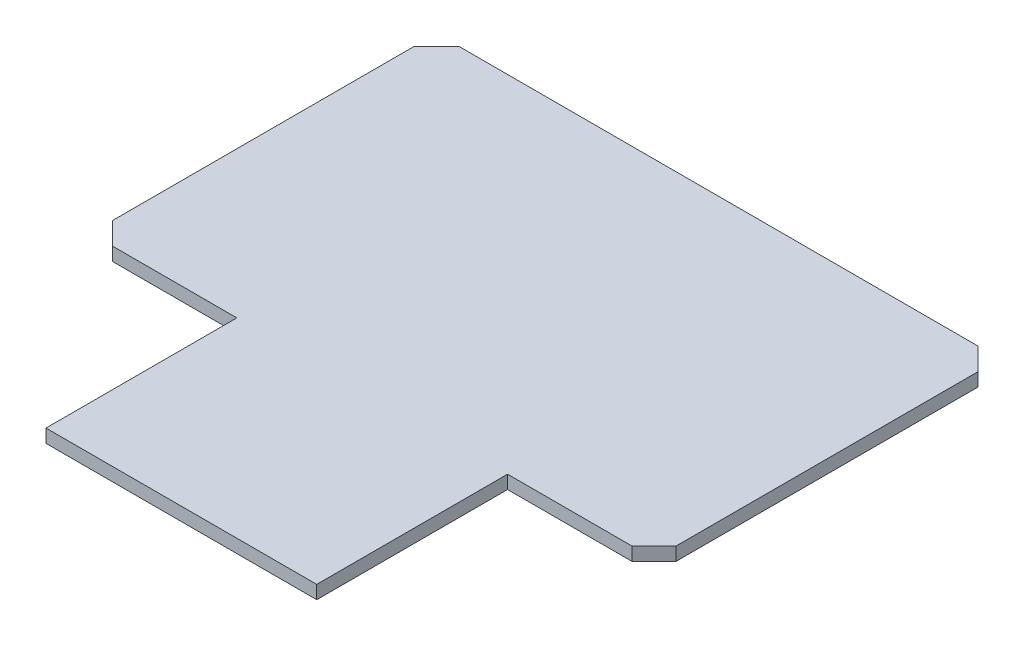
ISO-10303-21;
HEADER;
FILE_DESCRIPTION(('STEP AP214'),'2;1');
FILE_NAME('part.step','',(''),(''),'','','');
FILE_SCHEMA(('AUTOMOTIVE_DESIGN { 1 0 10303 214 1 1 1 1 }'));
ENDSEC;
DATA;
#1=APPLICATION_CONTEXT('core data for automotive mechanical design processes');
#2=APPLICATION_PROTOCOL_DEFINITION('international standard','automotive_design',2000,#1);
#3=PRODUCT_CONTEXT('',#1,'mechanical');
#4=PRODUCT('Part','Part','',(#3));
#5=PRODUCT_RELATED_PRODUCT_CATEGORY('part','',(#4));
#6=PRODUCT_DEFINITION_FORMATION('','',#4);
#7=PRODUCT_DEFINITION_CONTEXT('part definition',#1,'design');
#8=PRODUCT_DEFINITION('design','',#6,#7);
#9=PRODUCT_DEFINITION_SHAPE('','',#8);
#10=(LENGTH_UNIT() NAMED_UNIT(*) SI_UNIT(.MILLI.,.METRE.));
#11=(NAMED_UNIT(*) PLANE_ANGLE_UNIT() SI_UNIT($,.RADIAN.));
#12=(NAMED_UNIT(*) SI_UNIT($,.STERADIAN.) SOLID_ANGLE_UNIT());
#13=UNCERTAINTY_MEASURE_WITH_UNIT(LENGTH_MEASURE(1.E-05),#10,'distance_accuracy_value','');
#14=(GEOMETRIC_REPRESENTATION_CONTEXT(3) GLOBAL_UNCERTAINTY_ASSIGNED_CONTEXT((#13)) GLOBAL_UNIT_ASSIGNED_CONTEXT((#10,
#11,#12)) REPRESENTATION_CONTEXT('',''));
#15=CARTESIAN_POINT('',(0.,0.,0.));
#16=DIRECTION('',(0.,0.,1.));
#17=DIRECTION('',(1.,0.,0.));
#18=AXIS2_PLACEMENT_3D('',#15,#16,#17);
#19=CARTESIAN_POINT('',(30.5,3.,-43.));
#20=DIRECTION('',(-1.,0.,0.));
#21=DIRECTION('',(0.,0.,1.));
#22=AXIS2_PLACEMENT_3D('',#19,#20,#21);
#23=PLANE('',#22);
#24=DIRECTION('',(0.,0.,-1.));
#25=VECTOR('',#24,1.);
#26=CARTESIAN_POINT('',(30.5,0.,-43.));
#27=LINE('',#26,#25);
#28=CARTESIAN_POINT('',(30.5,0.,0.));
#29=VERTEX_POINT('',#28);
#30=CARTESIAN_POINT('',(30.5,0.,-43.));
#31=VERTEX_POINT('',#30);
#32=EDGE_CURVE('E215',#29,#31,#27,.T.);
#33=ORIENTED_EDGE('',*,*,#32,.T.);
#34=DIRECTION('',(0.,-1.,0.));
#35=VECTOR('',#34,1.);
#36=CARTESIAN_POINT('',(30.5,3.,-43.));
#37=LINE('',#36,#35);
#38=CARTESIAN_POINT('',(30.5,3.,-43.));
#39=VERTEX_POINT('',#38);
#40=EDGE_CURVE('E135',#39,#31,#37,.T.);
#41=ORIENTED_EDGE('',*,*,#40,.F.);
#42=DIRECTION('',(0.,0.,-1.));
#43=VECTOR('',#42,1.);
#44=CARTESIAN_POINT('',(30.5,3.,-43.));
#45=LINE('',#44,#43);
#46=CARTESIAN_POINT('',(30.5,3.,0.));
#47=VERTEX_POINT('',#46);
#48=EDGE_CURVE('E130',#47,#39,#45,.T.);
#49=ORIENTED_EDGE('',*,*,#48,.F.);
#50=DIRECTION('',(0.,-1.,0.));
#51=VECTOR('',#50,1.);
#52=CARTESIAN_POINT('',(30.5,3.,0.));
#53=LINE('',#52,#51);
#54=EDGE_CURVE('E133',#47,#29,#53,.T.);
#55=ORIENTED_EDGE('',*,*,#54,.T.);
#56=EDGE_LOOP('',(#33,#41,#49,#55));
#57=FACE_BOUND('',#56,.T.);
#58=ADVANCED_FACE('F39',(#57),#23,.F.);
#59=CARTESIAN_POINT('',(63.5,3.,-43.));
#60=DIRECTION('',(0.,0.,-1.));
#61=DIRECTION('',(-1.,0.,0.));
#62=AXIS2_PLACEMENT_3D('',#59,#60,#61);
#63=PLANE('',#62);
#64=DIRECTION('',(1.,0.,0.));
#65=VECTOR('',#64,1.);
#66=CARTESIAN_POINT('',(63.5,0.,-43.));
#67=LINE('',#66,#65);
#68=CARTESIAN_POINT('',(58.5,0.,-43.));
#69=VERTEX_POINT('',#68);
#70=EDGE_CURVE('E193',#31,#69,#67,.T.);
#71=ORIENTED_EDGE('',*,*,#70,.T.);
#72=DIRECTION('',(0.,1.,0.));
#73=VECTOR('',#72,1.);
#74=CARTESIAN_POINT('',(58.5,3.,-43.));
#75=LINE('',#74,#73);
#76=CARTESIAN_POINT('',(58.5,3.,-43.));
#77=VERTEX_POINT('',#76);
#78=EDGE_CURVE('E187',#69,#77,#75,.T.);
#79=ORIENTED_EDGE('',*,*,#78,.T.);
#80=DIRECTION('',(1.,0.,0.));
#81=VECTOR('',#80,1.);
#82=CARTESIAN_POINT('',(63.5,3.,-43.));
#83=LINE('',#82,#81);
#84=EDGE_CURVE('E138',#39,#77,#83,.T.);
#85=ORIENTED_EDGE('',*,*,#84,.F.);
#86=ORIENTED_EDGE('',*,*,#40,.T.);
#87=EDGE_LOOP('',(#71,#79,#85,#86));
#88=FACE_BOUND('',#87,.T.);
#89=ADVANCED_FACE('F191',(#88),#63,.F.);
#90=CARTESIAN_POINT('',(63.5,3.,-121.));
#91=DIRECTION('',(-1.,0.,0.));
#92=DIRECTION('',(0.,0.,1.));
#93=AXIS2_PLACEMENT_3D('',#90,#91,#92);
#94=PLANE('',#93);
#95=DIRECTION('',(0.,0.,-1.));
#96=VECTOR('',#95,1.);
#97=CARTESIAN_POINT('',(63.5,3.,-121.));
#98=LINE('',#97,#96);
#99=CARTESIAN_POINT('',(63.5,3.,-48.));
#100=VERTEX_POINT('',#99);
#101=CARTESIAN_POINT('',(63.5,3.,-116.));
#102=VERTEX_POINT('',#101);
#103=EDGE_CURVE('E197',#100,#102,#98,.T.);
#104=ORIENTED_EDGE('',*,*,#103,.F.);
#105=DIRECTION('',(0.,-1.,0.));
#106=VECTOR('',#105,1.);
#107=CARTESIAN_POINT('',(63.5,3.,-48.));
#108=LINE('',#107,#106);
#109=CARTESIAN_POINT('',(63.5,0.,-48.));
#110=VERTEX_POINT('',#109);
#111=EDGE_CURVE('E184',#100,#110,#108,.T.);
#112=ORIENTED_EDGE('',*,*,#111,.T.);
#113=DIRECTION('',(0.,0.,-1.));
#114=VECTOR('',#113,1.);
#115=CARTESIAN_POINT('',(63.5,0.,-121.));
#116=LINE('',#115,#114);
#117=CARTESIAN_POINT('',(63.5,0.,-116.));
#118=VERTEX_POINT('',#117);
#119=EDGE_CURVE('E205',#110,#118,#116,.T.);
#120=ORIENTED_EDGE('',*,*,#119,.T.);
#121=DIRECTION('',(0.,1.,0.));
#122=VECTOR('',#121,1.);
#123=CARTESIAN_POINT('',(63.5,3.,-116.));
#124=LINE('',#123,#122);
#125=EDGE_CURVE('E182',#118,#102,#124,.T.);
#126=ORIENTED_EDGE('',*,*,#125,.T.);
#127=EDGE_LOOP('',(#104,#112,#120,#126));
#128=FACE_BOUND('',#127,.T.);
#129=ADVANCED_FACE('F204',(#128),#94,.F.);
#130=CARTESIAN_POINT('',(-63.5,3.,-121.));
#131=DIRECTION('',(0.,0.,1.));
#132=DIRECTION('',(1.,0.,0.));
#133=AXIS2_PLACEMENT_3D('',#130,#131,#132);
#134=PLANE('',#133);
#135=DIRECTION('',(-1.,0.,0.));
#136=VECTOR('',#135,1.);
#137=CARTESIAN_POINT('',(-63.5,3.,-121.));
#138=LINE('',#137,#136);
#139=CARTESIAN_POINT('',(58.5,3.,-121.));
#140=VERTEX_POINT('',#139);
#141=CARTESIAN_POINT('',(-58.5,3.,-121.));
#142=VERTEX_POINT('',#141);
#143=EDGE_CURVE('E240',#140,#142,#138,.T.);
#144=ORIENTED_EDGE('',*,*,#143,.F.);
#145=DIRECTION('',(0.,-1.,0.));
#146=VECTOR('',#145,1.);
#147=CARTESIAN_POINT('',(58.5,3.,-121.));
#148=LINE('',#147,#146);
#149=CARTESIAN_POINT('',(58.5,0.,-121.));
#150=VERTEX_POINT('',#149);
#151=EDGE_CURVE('E11',#140,#150,#148,.T.);
#152=ORIENTED_EDGE('',*,*,#151,.T.);
#153=DIRECTION('',(-1.,0.,0.));
#154=VECTOR('',#153,1.);
#155=CARTESIAN_POINT('',(-63.5,0.,-121.));
#156=LINE('',#155,#154);
#157=CARTESIAN_POINT('',(-58.5,0.,-121.));
#158=VERTEX_POINT('',#157);
#159=EDGE_CURVE('E211',#150,#158,#156,.T.);
#160=ORIENTED_EDGE('',*,*,#159,.T.);
#161=DIRECTION('',(0.,1.,0.));
#162=VECTOR('',#161,1.);
#163=CARTESIAN_POINT('',(-58.5,3.,-121.));
#164=LINE('',#163,#162);
#165=EDGE_CURVE('E48',#158,#142,#164,.T.);
#166=ORIENTED_EDGE('',*,*,#165,.T.);
#167=EDGE_LOOP('',(#144,#152,#160,#166));
#168=FACE_BOUND('',#167,.T.);
#169=ADVANCED_FACE('F245',(#168),#134,.F.);
#170=CARTESIAN_POINT('',(-63.5,3.,-43.));
#171=DIRECTION('',(1.,0.,0.));
#172=DIRECTION('',(0.,0.,-1.));
#173=AXIS2_PLACEMENT_3D('',#170,#171,#172);
#174=PLANE('',#173);
#175=DIRECTION('',(0.,0.,1.));
#176=VECTOR('',#175,1.);
#177=CARTESIAN_POINT('',(-63.5,0.,-43.));
#178=LINE('',#177,#176);
#179=CARTESIAN_POINT('',(-63.5,0.,-116.));
#180=VERTEX_POINT('',#179);
#181=CARTESIAN_POINT('',(-63.5,0.,-48.));
#182=VERTEX_POINT('',#181);
#183=EDGE_CURVE('E213',#180,#182,#178,.T.);
#184=ORIENTED_EDGE('',*,*,#183,.T.);
#185=DIRECTION('',(0.,1.,0.));
#186=VECTOR('',#185,1.);
#187=CARTESIAN_POINT('',(-63.5,3.,-48.));
#188=LINE('',#187,#186);
#189=CARTESIAN_POINT('',(-63.5,3.,-48.));
#190=VERTEX_POINT('',#189);
#191=EDGE_CURVE('E173',#182,#190,#188,.T.);
#192=ORIENTED_EDGE('',*,*,#191,.T.);
#193=DIRECTION('',(0.,0.,1.));
#194=VECTOR('',#193,1.);
#195=CARTESIAN_POINT('',(-63.5,3.,-43.));
#196=LINE('',#195,#194);
#197=CARTESIAN_POINT('',(-63.5,3.,-116.));
#198=VERTEX_POINT('',#197);
#199=EDGE_CURVE('E238',#198,#190,#196,.T.);
#200=ORIENTED_EDGE('',*,*,#199,.F.);
#201=DIRECTION('',(0.,-1.,0.));
#202=VECTOR('',#201,1.);
#203=CARTESIAN_POINT('',(-63.5,3.,-116.));
#204=LINE('',#203,#202);
#205=EDGE_CURVE('E170',#198,#180,#204,.T.);
#206=ORIENTED_EDGE('',*,*,#205,.T.);
#207=EDGE_LOOP('',(#184,#192,#200,#206));
#208=FACE_BOUND('',#207,.T.);
#209=ADVANCED_FACE('F252',(#208),#174,.F.);
#210=CARTESIAN_POINT('',(-30.5,3.,-43.));
#211=DIRECTION('',(0.,0.,-1.));
#212=DIRECTION('',(-1.,0.,0.));
#213=AXIS2_PLACEMENT_3D('',#210,#211,#212);
#214=PLANE('',#213);
#215=DIRECTION('',(1.,0.,0.));
#216=VECTOR('',#215,1.);
#217=CARTESIAN_POINT('',(-30.5,3.,-43.));
#218=LINE('',#217,#216);
#219=CARTESIAN_POINT('',(-58.5,3.,-43.));
#220=VERTEX_POINT('',#219);
#221=CARTESIAN_POINT('',(-30.5,3.,-43.));
#222=VERTEX_POINT('',#221);
#223=EDGE_CURVE('E236',#220,#222,#218,.T.);
#224=ORIENTED_EDGE('',*,*,#223,.F.);
#225=DIRECTION('',(0.,-1.,0.));
#226=VECTOR('',#225,1.);
#227=CARTESIAN_POINT('',(-58.5,3.,-43.));
#228=LINE('',#227,#226);
#229=CARTESIAN_POINT('',(-58.5,0.,-43.));
#230=VERTEX_POINT('',#229);
#231=EDGE_CURVE('E154',#220,#230,#228,.T.);
#232=ORIENTED_EDGE('',*,*,#231,.T.);
#233=DIRECTION('',(1.,0.,0.));
#234=VECTOR('',#233,1.);
#235=CARTESIAN_POINT('',(-30.5,0.,-43.));
#236=LINE('',#235,#234);
#237=CARTESIAN_POINT('',(-30.5,0.,-43.));
#238=VERTEX_POINT('',#237);
#239=EDGE_CURVE('E221',#230,#238,#236,.T.);
#240=ORIENTED_EDGE('',*,*,#239,.T.);
#241=DIRECTION('',(0.,-1.,0.));
#242=VECTOR('',#241,1.);
#243=CARTESIAN_POINT('',(-30.5,3.,-43.));
#244=LINE('',#243,#242);
#245=EDGE_CURVE('E159',#222,#238,#244,.T.);
#246=ORIENTED_EDGE('',*,*,#245,.F.);
#247=EDGE_LOOP('',(#224,#232,#240,#246));
#248=FACE_BOUND('',#247,.T.);
#249=ADVANCED_FACE('F258',(#248),#214,.F.);
#250=CARTESIAN_POINT('',(-30.5,3.,0.));
#251=DIRECTION('',(1.,0.,0.));
#252=DIRECTION('',(0.,0.,-1.));
#253=AXIS2_PLACEMENT_3D('',#250,#251,#252);
#254=PLANE('',#253);
#255=DIRECTION('',(0.,0.,1.));
#256=VECTOR('',#255,1.);
#257=CARTESIAN_POINT('',(-30.5,0.,0.));
#258=LINE('',#257,#256);
#259=CARTESIAN_POINT('',(-30.5,0.,0.));
#260=VERTEX_POINT('',#259);
#261=EDGE_CURVE('E223',#238,#260,#258,.T.);
#262=ORIENTED_EDGE('',*,*,#261,.T.);
#263=DIRECTION('',(0.,-1.,0.));
#264=VECTOR('',#263,1.);
#265=CARTESIAN_POINT('',(-30.5,3.,0.));
#266=LINE('',#265,#264);
#267=CARTESIAN_POINT('',(-30.5,3.,0.));
#268=VERTEX_POINT('',#267);
#269=EDGE_CURVE('E226',#268,#260,#266,.T.);
#270=ORIENTED_EDGE('',*,*,#269,.F.);
#271=DIRECTION('',(0.,0.,1.));
#272=VECTOR('',#271,1.);
#273=CARTESIAN_POINT('',(-30.5,3.,0.));
#274=LINE('',#273,#272);
#275=EDGE_CURVE('E145',#222,#268,#274,.T.);
#276=ORIENTED_EDGE('',*,*,#275,.F.);
#277=ORIENTED_EDGE('',*,*,#245,.T.);
#278=EDGE_LOOP('',(#262,#270,#276,#277));
#279=FACE_BOUND('',#278,.T.);
#280=ADVANCED_FACE('F231',(#279),#254,.F.);
#281=CARTESIAN_POINT('',(0.,3.,0.));
#282=DIRECTION('',(0.,0.,-1.));
#283=DIRECTION('',(-1.,0.,0.));
#284=AXIS2_PLACEMENT_3D('',#281,#282,#283);
#285=PLANE('',#284);
#286=DIRECTION('',(1.,0.,0.));
#287=VECTOR('',#286,1.);
#288=CARTESIAN_POINT('',(0.,0.,0.));
#289=LINE('',#288,#287);
#290=EDGE_CURVE('E149',#260,#29,#289,.T.);
#291=ORIENTED_EDGE('',*,*,#290,.T.);
#292=ORIENTED_EDGE('',*,*,#54,.F.);
#293=DIRECTION('',(1.,0.,0.));
#294=VECTOR('',#293,1.);
#295=CARTESIAN_POINT('',(30.5,3.,0.));
#296=LINE('',#295,#294);
#297=EDGE_CURVE('E139',#268,#47,#296,.T.);
#298=ORIENTED_EDGE('',*,*,#297,.F.);
#299=ORIENTED_EDGE('',*,*,#269,.T.);
#300=EDGE_LOOP('',(#291,#292,#298,#299));
#301=FACE_BOUND('',#300,.T.);
#302=ADVANCED_FACE('F151',(#301),#285,.F.);
#303=CARTESIAN_POINT('',(0.,3.,0.));
#304=DIRECTION('',(0.,-1.,0.));
#305=DIRECTION('',(0.,0.,-1.));
#306=AXIS2_PLACEMENT_3D('',#303,#304,#305);
#307=PLANE('',#306);
#308=ORIENTED_EDGE('',*,*,#199,.T.);
#309=DIRECTION('',(-0.707106781186547,0.,-0.707106781186549));
#310=VECTOR('',#309,1.);
#311=CARTESIAN_POINT('',(-58.5,3.,-43.));
#312=LINE('',#311,#310);
#313=EDGE_CURVE('E180',#190,#220,#312,.F.);
#314=ORIENTED_EDGE('',*,*,#313,.T.);
#315=ORIENTED_EDGE('',*,*,#223,.T.);
#316=ORIENTED_EDGE('',*,*,#275,.T.);
#317=ORIENTED_EDGE('',*,*,#297,.T.);
#318=ORIENTED_EDGE('',*,*,#48,.T.);
#319=ORIENTED_EDGE('',*,*,#84,.T.);
#320=DIRECTION('',(-0.707106781186549,0.,0.707106781186547));
#321=VECTOR('',#320,1.);
#322=CARTESIAN_POINT('',(63.5,3.,-48.));
#323=LINE('',#322,#321);
#324=EDGE_CURVE('E178',#77,#100,#323,.F.);
#325=ORIENTED_EDGE('',*,*,#324,.T.);
#326=ORIENTED_EDGE('',*,*,#103,.T.);
#327=DIRECTION('',(0.707106781186547,0.,0.707106781186549));
#328=VECTOR('',#327,1.);
#329=CARTESIAN_POINT('',(58.5,3.,-121.));
#330=LINE('',#329,#328);
#331=EDGE_CURVE('E61',#102,#140,#330,.F.);
#332=ORIENTED_EDGE('',*,*,#331,.T.);
#333=ORIENTED_EDGE('',*,*,#143,.T.);
#334=DIRECTION('',(0.707106781186549,0.,-0.707106781186547));
#335=VECTOR('',#334,1.);
#336=CARTESIAN_POINT('',(-63.5,3.,-116.));
#337=LINE('',#336,#335);
#338=EDGE_CURVE('E175',#142,#198,#337,.F.);
#339=ORIENTED_EDGE('',*,*,#338,.T.);
#340=EDGE_LOOP('',(#308,#314,#315,#316,#317,#318,#319,#325,#326,#332,#333,#339));
#341=FACE_BOUND('',#340,.T.);
#342=ADVANCED_FACE('F143',(#341),#307,.F.);
#343=CARTESIAN_POINT('',(0.,0.,0.));
#344=DIRECTION('',(0.,-1.,0.));
#345=DIRECTION('',(0.,0.,-1.));
#346=AXIS2_PLACEMENT_3D('',#343,#344,#345);
#347=PLANE('',#346);
#348=ORIENTED_EDGE('',*,*,#239,.F.);
#349=DIRECTION('',(0.707106781186547,0.,0.707106781186549));
#350=VECTOR('',#349,1.);
#351=CARTESIAN_POINT('',(-7.75000000000009,0.,7.75000000000007));
#352=LINE('',#351,#350);
#353=EDGE_CURVE('E168',#230,#182,#352,.F.);
#354=ORIENTED_EDGE('',*,*,#353,.T.);
#355=ORIENTED_EDGE('',*,*,#183,.F.);
#356=DIRECTION('',(-0.707106781186549,0.,0.707106781186547));
#357=VECTOR('',#356,1.);
#358=CARTESIAN_POINT('',(-89.7499999999999,0.,-89.7500000000002));
#359=LINE('',#358,#357);
#360=EDGE_CURVE('E157',#180,#158,#359,.F.);
#361=ORIENTED_EDGE('',*,*,#360,.T.);
#362=ORIENTED_EDGE('',*,*,#159,.F.);
#363=DIRECTION('',(-0.707106781186547,0.,-0.707106781186549));
#364=VECTOR('',#363,1.);
#365=CARTESIAN_POINT('',(89.7500000000001,0.,-89.7499999999998));
#366=LINE('',#365,#364);
#367=EDGE_CURVE('E164',#150,#118,#366,.F.);
#368=ORIENTED_EDGE('',*,*,#367,.T.);
#369=ORIENTED_EDGE('',*,*,#119,.F.);
#370=DIRECTION('',(0.707106781186549,0.,-0.707106781186547));
#371=VECTOR('',#370,1.);
#372=CARTESIAN_POINT('',(7.74999999999992,0.,7.74999999999994));
#373=LINE('',#372,#371);
#374=EDGE_CURVE('E166',#110,#69,#373,.F.);
#375=ORIENTED_EDGE('',*,*,#374,.T.);
#376=ORIENTED_EDGE('',*,*,#70,.F.);
#377=ORIENTED_EDGE('',*,*,#32,.F.);
#378=ORIENTED_EDGE('',*,*,#290,.F.);
#379=ORIENTED_EDGE('',*,*,#261,.F.);
#380=EDGE_LOOP('',(#348,#354,#355,#361,#362,#368,#369,#375,#376,#377,#378,#379));
#381=FACE_BOUND('',#380,.T.);
#382=ADVANCED_FACE('F209',(#381),#347,.T.);
#383=CARTESIAN_POINT('',(-58.5,3.,-43.));
#384=DIRECTION('',(0.707106781186548,0.,-0.707106781186546));
#385=DIRECTION('',(0.,-1.,0.));
#386=AXIS2_PLACEMENT_3D('',#383,#384,#385);
#387=PLANE('',#386);
#388=ORIENTED_EDGE('',*,*,#313,.F.);
#389=ORIENTED_EDGE('',*,*,#191,.F.);
#390=ORIENTED_EDGE('',*,*,#353,.F.);
#391=ORIENTED_EDGE('',*,*,#231,.F.);
#392=EDGE_LOOP('',(#388,#389,#390,#391));
#393=FACE_BOUND('',#392,.T.);
#394=ADVANCED_FACE('F257',(#393),#387,.F.);
#395=CARTESIAN_POINT('',(63.5,3.,-48.));
#396=DIRECTION('',(-0.707106781186546,0.,-0.707106781186548));
#397=DIRECTION('',(0.,-1.,0.));
#398=AXIS2_PLACEMENT_3D('',#395,#396,#397);
#399=PLANE('',#398);
#400=ORIENTED_EDGE('',*,*,#324,.F.);
#401=ORIENTED_EDGE('',*,*,#78,.F.);
#402=ORIENTED_EDGE('',*,*,#374,.F.);
#403=ORIENTED_EDGE('',*,*,#111,.F.);
#404=EDGE_LOOP('',(#400,#401,#402,#403));
#405=FACE_BOUND('',#404,.T.);
#406=ADVANCED_FACE('F200',(#405),#399,.F.);
#407=CARTESIAN_POINT('',(58.5,3.,-121.));
#408=DIRECTION('',(-0.707106781186548,0.,0.707106781186546));
#409=DIRECTION('',(0.,-1.,0.));
#410=AXIS2_PLACEMENT_3D('',#407,#408,#409);
#411=PLANE('',#410);
#412=ORIENTED_EDGE('',*,*,#331,.F.);
#413=ORIENTED_EDGE('',*,*,#125,.F.);
#414=ORIENTED_EDGE('',*,*,#367,.F.);
#415=ORIENTED_EDGE('',*,*,#151,.F.);
#416=EDGE_LOOP('',(#412,#413,#414,#415));
#417=FACE_BOUND('',#416,.T.);
#418=ADVANCED_FACE('F244',(#417),#411,.F.);
#419=CARTESIAN_POINT('',(-63.5,3.,-116.));
#420=DIRECTION('',(0.707106781186546,0.,0.707106781186548));
#421=DIRECTION('',(0.,-1.,0.));
#422=AXIS2_PLACEMENT_3D('',#419,#420,#421);
#423=PLANE('',#422);
#424=ORIENTED_EDGE('',*,*,#338,.F.);
#425=ORIENTED_EDGE('',*,*,#165,.F.);
#426=ORIENTED_EDGE('',*,*,#360,.F.);
#427=ORIENTED_EDGE('',*,*,#205,.F.);
#428=EDGE_LOOP('',(#424,#425,#426,#427));
#429=FACE_BOUND('',#428,.T.);
#430=ADVANCED_FACE('F42',(#429),#423,.F.);
#431=CLOSED_SHELL('',(#58,#89,#129,#169,#209,#249,#280,#302,#342,#382,#394,#406,#418,#430));
#432=MANIFOLD_SOLID_BREP('B2',#431);
#433=ADVANCED_BREP_SHAPE_REPRESENTATION('',(#18,#432),#14);
#434=SHAPE_DEFINITION_REPRESENTATION(#9,#433);
ENDSEC;
END-ISO-10303-21;
